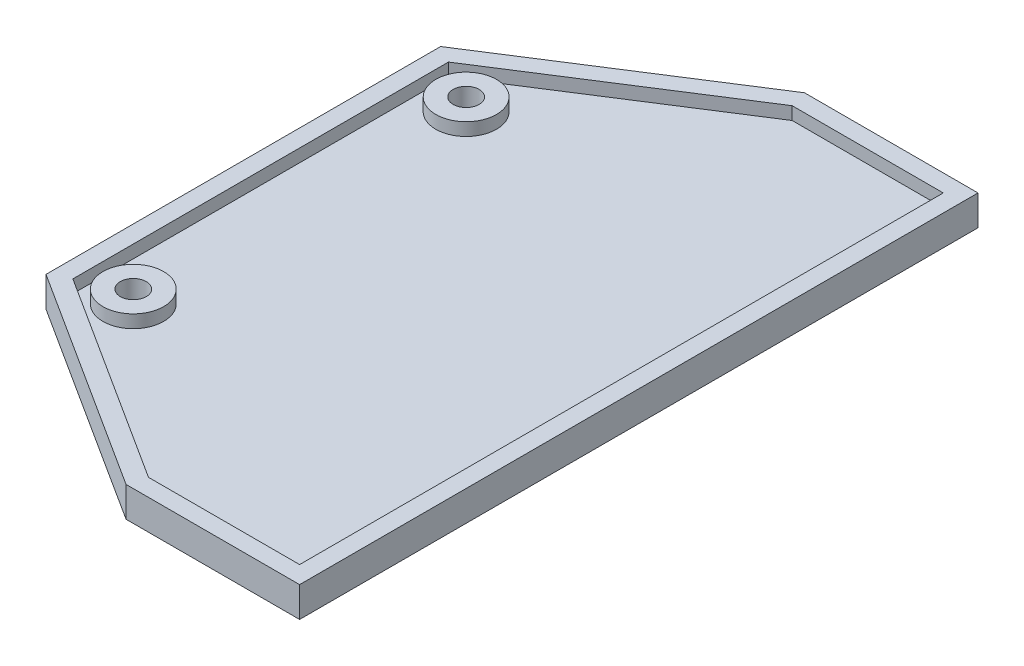
ISO-10303-21;
HEADER;
FILE_DESCRIPTION(('STEP AP214'),'2;1');
FILE_NAME('part.step','',(''),(''),'','','');
FILE_SCHEMA(('AUTOMOTIVE_DESIGN { 1 0 10303 214 1 1 1 1 }'));
ENDSEC;
DATA;
#1=APPLICATION_CONTEXT('core data for automotive mechanical design processes');
#2=APPLICATION_PROTOCOL_DEFINITION('international standard','automotive_design',2000,#1);
#3=PRODUCT_CONTEXT('',#1,'mechanical');
#4=PRODUCT('Part','Part','',(#3));
#5=PRODUCT_RELATED_PRODUCT_CATEGORY('part','',(#4));
#6=PRODUCT_DEFINITION_FORMATION('','',#4);
#7=PRODUCT_DEFINITION_CONTEXT('part definition',#1,'design');
#8=PRODUCT_DEFINITION('design','',#6,#7);
#9=PRODUCT_DEFINITION_SHAPE('','',#8);
#10=(LENGTH_UNIT() NAMED_UNIT(*) SI_UNIT(.MILLI.,.METRE.));
#11=(NAMED_UNIT(*) PLANE_ANGLE_UNIT() SI_UNIT($,.RADIAN.));
#12=(NAMED_UNIT(*) SI_UNIT($,.STERADIAN.) SOLID_ANGLE_UNIT());
#13=UNCERTAINTY_MEASURE_WITH_UNIT(LENGTH_MEASURE(1.E-05),#10,'distance_accuracy_value','');
#14=(GEOMETRIC_REPRESENTATION_CONTEXT(3) GLOBAL_UNCERTAINTY_ASSIGNED_CONTEXT((#13)) GLOBAL_UNIT_ASSIGNED_CONTEXT((#10,
#11,#12)) REPRESENTATION_CONTEXT('',''));
#15=CARTESIAN_POINT('',(0.,0.,0.));
#16=DIRECTION('',(0.,0.,1.));
#17=DIRECTION('',(1.,0.,0.));
#18=AXIS2_PLACEMENT_3D('',#15,#16,#17);
#19=CARTESIAN_POINT('',(-21.9551217627896,3.48000000000004,0.0716000000000189));
#20=DIRECTION('',(0.,-1.,0.));
#21=DIRECTION('',(0.,0.,-1.));
#22=AXIS2_PLACEMENT_3D('',#19,#20,#21);
#23=PLANE('',#22);
#24=CARTESIAN_POINT('',(45.8988782372104,3.48000000000004,19.1788));
#25=DIRECTION('',(0.,-1.,0.));
#26=DIRECTION('',(1.,0.,0.));
#27=AXIS2_PLACEMENT_3D('',#24,#25,#26);
#28=CIRCLE('',#27,1.5);
#29=CARTESIAN_POINT('',(47.3988782372104,3.48000000000004,19.1788));
#30=VERTEX_POINT('',#29);
#31=EDGE_CURVE('E41',#30,#30,#28,.T.);
#32=ORIENTED_EDGE('',*,*,#31,.T.);
#33=EDGE_LOOP('',(#32));
#34=FACE_BOUND('',#33,.T.);
#35=CARTESIAN_POINT('',(45.8988782372104,3.48000000000004,19.1788));
#36=DIRECTION('',(0.,-1.,0.));
#37=DIRECTION('',(1.,0.,0.));
#38=AXIS2_PLACEMENT_3D('',#35,#36,#37);
#39=CIRCLE('',#38,3.5);
#40=CARTESIAN_POINT('',(49.3988782372104,3.48000000000004,19.1788));
#41=VERTEX_POINT('',#40);
#42=EDGE_CURVE('E234',#41,#41,#39,.T.);
#43=ORIENTED_EDGE('',*,*,#42,.F.);
#44=EDGE_LOOP('',(#43));
#45=FACE_BOUND('',#44,.T.);
#46=ADVANCED_FACE('F37',(#34,#45),#23,.F.);
#47=CARTESIAN_POINT('',(45.8988782372104,3.48000000000004,-19.1788));
#48=DIRECTION('',(0.,-1.,0.));
#49=DIRECTION('',(1.,0.,0.));
#50=AXIS2_PLACEMENT_3D('',#47,#48,#49);
#51=CIRCLE('',#50,1.5);
#52=CARTESIAN_POINT('',(47.3988782372104,3.48000000000004,-19.1788));
#53=VERTEX_POINT('',#52);
#54=EDGE_CURVE('E11',#53,#53,#51,.T.);
#55=ORIENTED_EDGE('',*,*,#54,.T.);
#56=EDGE_LOOP('',(#55));
#57=FACE_BOUND('',#56,.T.);
#58=CARTESIAN_POINT('',(45.8988782372104,3.48000000000004,-19.1788));
#59=DIRECTION('',(0.,-1.,0.));
#60=DIRECTION('',(1.,0.,0.));
#61=AXIS2_PLACEMENT_3D('',#58,#59,#60);
#62=CIRCLE('',#61,3.5);
#63=CARTESIAN_POINT('',(49.3988782372104,3.48000000000004,-19.1788));
#64=VERTEX_POINT('',#63);
#65=EDGE_CURVE('E125',#64,#64,#62,.T.);
#66=ORIENTED_EDGE('',*,*,#65,.F.);
#67=EDGE_LOOP('',(#66));
#68=FACE_BOUND('',#67,.T.);
#69=ADVANCED_FACE('F275',(#57,#68),#23,.F.);
#70=CARTESIAN_POINT('',(0.,0.,0.));
#71=DIRECTION('',(0.,1.,0.));
#72=DIRECTION('',(0.,0.,1.));
#73=AXIS2_PLACEMENT_3D('',#70,#71,#72);
#74=PLANE('',#73);
#75=DIRECTION('',(0.,0.,-1.));
#76=VECTOR('',#75,1.);
#77=CARTESIAN_POINT('',(84.9748782372105,0.,39.0892));
#78=LINE('',#77,#76);
#79=CARTESIAN_POINT('',(84.9748782372105,0.,39.0892));
#80=VERTEX_POINT('',#79);
#81=CARTESIAN_POINT('',(84.9748782372105,0.,-39.0892));
#82=VERTEX_POINT('',#81);
#83=EDGE_CURVE('E106',#80,#82,#78,.T.);
#84=ORIENTED_EDGE('',*,*,#83,.F.);
#85=DIRECTION('',(1.,0.,0.));
#86=VECTOR('',#85,1.);
#87=CARTESIAN_POINT('',(84.9748782372105,0.,39.0892));
#88=LINE('',#87,#86);
#89=CARTESIAN_POINT('',(64.9748782372105,0.,39.0892));
#90=VERTEX_POINT('',#89);
#91=EDGE_CURVE('E139',#90,#80,#88,.T.);
#92=ORIENTED_EDGE('',*,*,#91,.F.);
#93=DIRECTION('',(0.842533357884091,0.,0.538644169050922));
#94=VECTOR('',#93,1.);
#95=CARTESIAN_POINT('',(64.9748782372105,0.,39.0892));
#96=LINE('',#95,#94);
#97=CARTESIAN_POINT('',(39.3988782372104,0.,22.7380809152389));
#98=VERTEX_POINT('',#97);
#99=EDGE_CURVE('E136',#98,#90,#96,.T.);
#100=ORIENTED_EDGE('',*,*,#99,.F.);
#101=DIRECTION('',(0.,0.,1.));
#102=VECTOR('',#101,1.);
#103=CARTESIAN_POINT('',(39.3988782372104,0.,-22.7380809152389));
#104=LINE('',#103,#102);
#105=CARTESIAN_POINT('',(39.3988782372104,0.,-22.7380809152389));
#106=VERTEX_POINT('',#105);
#107=EDGE_CURVE('E132',#106,#98,#104,.T.);
#108=ORIENTED_EDGE('',*,*,#107,.F.);
#109=DIRECTION('',(-0.842533357884091,0.,0.538644169050922));
#110=VECTOR('',#109,1.);
#111=CARTESIAN_POINT('',(64.9748782372105,0.,-39.0892));
#112=LINE('',#111,#110);
#113=CARTESIAN_POINT('',(64.9748782372105,0.,-39.0892));
#114=VERTEX_POINT('',#113);
#115=EDGE_CURVE('E109',#114,#106,#112,.T.);
#116=ORIENTED_EDGE('',*,*,#115,.F.);
#117=DIRECTION('',(-1.,0.,0.));
#118=VECTOR('',#117,1.);
#119=CARTESIAN_POINT('',(84.9748782372105,0.,-39.0892));
#120=LINE('',#119,#118);
#121=EDGE_CURVE('E95',#82,#114,#120,.T.);
#122=ORIENTED_EDGE('',*,*,#121,.F.);
#123=EDGE_LOOP('',(#84,#92,#100,#108,#116,#122));
#124=FACE_BOUND('',#123,.T.);
#125=CARTESIAN_POINT('',(45.8988782372104,0.,-19.1788));
#126=DIRECTION('',(0.,1.,0.));
#127=DIRECTION('',(0.,0.,1.));
#128=AXIS2_PLACEMENT_3D('',#125,#126,#127);
#129=CIRCLE('',#128,1.5);
#130=CARTESIAN_POINT('',(45.8988782372104,0.,-17.6788));
#131=VERTEX_POINT('',#130);
#132=EDGE_CURVE('E121',#131,#131,#129,.T.);
#133=ORIENTED_EDGE('',*,*,#132,.T.);
#134=EDGE_LOOP('',(#133));
#135=FACE_BOUND('',#134,.T.);
#136=CARTESIAN_POINT('',(45.8988782372104,0.,19.1788));
#137=DIRECTION('',(0.,1.,0.));
#138=DIRECTION('',(0.,0.,-1.));
#139=AXIS2_PLACEMENT_3D('',#136,#137,#138);
#140=CIRCLE('',#139,1.5);
#141=CARTESIAN_POINT('',(45.8988782372104,0.,17.6788));
#142=VERTEX_POINT('',#141);
#143=EDGE_CURVE('E124',#142,#142,#140,.T.);
#144=ORIENTED_EDGE('',*,*,#143,.T.);
#145=EDGE_LOOP('',(#144));
#146=FACE_BOUND('',#145,.T.);
#147=ADVANCED_FACE('F103',(#124,#135,#146),#74,.F.);
#148=CARTESIAN_POINT('',(84.9748782372105,93.9732815327194,39.0892));
#149=DIRECTION('',(-1.,0.,0.));
#150=DIRECTION('',(0.,0.,1.));
#151=AXIS2_PLACEMENT_3D('',#148,#149,#150);
#152=PLANE('',#151);
#153=DIRECTION('',(0.,-1.,0.));
#154=VECTOR('',#153,1.);
#155=CARTESIAN_POINT('',(84.9748782372105,93.9732815327194,-39.0892));
#156=LINE('',#155,#154);
#157=CARTESIAN_POINT('',(84.9748782372105,3.48000000000004,-39.0892));
#158=VERTEX_POINT('',#157);
#159=EDGE_CURVE('E91',#158,#82,#156,.T.);
#160=ORIENTED_EDGE('',*,*,#159,.F.);
#161=DIRECTION('',(0.,0.,1.));
#162=VECTOR('',#161,1.);
#163=CARTESIAN_POINT('',(84.9748782372105,3.48000000000004,39.0892));
#164=LINE('',#163,#162);
#165=CARTESIAN_POINT('',(84.9748782372105,3.48000000000004,39.0892));
#166=VERTEX_POINT('',#165);
#167=EDGE_CURVE('E61',#158,#166,#164,.T.);
#168=ORIENTED_EDGE('',*,*,#167,.T.);
#169=DIRECTION('',(0.,-1.,0.));
#170=VECTOR('',#169,1.);
#171=CARTESIAN_POINT('',(84.9748782372105,93.9732815327194,39.0892));
#172=LINE('',#171,#170);
#173=EDGE_CURVE('E114',#166,#80,#172,.T.);
#174=ORIENTED_EDGE('',*,*,#173,.T.);
#175=ORIENTED_EDGE('',*,*,#83,.T.);
#176=EDGE_LOOP('',(#160,#168,#174,#175));
#177=FACE_BOUND('',#176,.T.);
#178=ADVANCED_FACE('F112',(#177),#152,.F.);
#179=CARTESIAN_POINT('',(84.9748782372105,93.9732815327194,-39.0892));
#180=DIRECTION('',(0.,0.,1.));
#181=DIRECTION('',(1.,0.,0.));
#182=AXIS2_PLACEMENT_3D('',#179,#180,#181);
#183=PLANE('',#182);
#184=DIRECTION('',(0.,-1.,0.));
#185=VECTOR('',#184,1.);
#186=CARTESIAN_POINT('',(64.9748782372105,93.9732815327194,-39.0892));
#187=LINE('',#186,#185);
#188=CARTESIAN_POINT('',(64.9748782372105,3.48000000000004,-39.0892));
#189=VERTEX_POINT('',#188);
#190=EDGE_CURVE('E128',#189,#114,#187,.T.);
#191=ORIENTED_EDGE('',*,*,#190,.F.);
#192=DIRECTION('',(1.,0.,0.));
#193=VECTOR('',#192,1.);
#194=CARTESIAN_POINT('',(84.9748782372105,3.48000000000004,-39.0892));
#195=LINE('',#194,#193);
#196=EDGE_CURVE('E97',#189,#158,#195,.T.);
#197=ORIENTED_EDGE('',*,*,#196,.T.);
#198=ORIENTED_EDGE('',*,*,#159,.T.);
#199=ORIENTED_EDGE('',*,*,#121,.T.);
#200=EDGE_LOOP('',(#191,#197,#198,#199));
#201=FACE_BOUND('',#200,.T.);
#202=ADVANCED_FACE('F94',(#201),#183,.F.);
#203=CARTESIAN_POINT('',(64.9748782372105,93.9732815327194,-39.0892));
#204=DIRECTION('',(0.538644169050922,0.,0.842533357884091));
#205=DIRECTION('',(0.842533357884091,0.,-0.538644169050922));
#206=AXIS2_PLACEMENT_3D('',#203,#204,#205);
#207=PLANE('',#206);
#208=DIRECTION('',(0.,-1.,0.));
#209=VECTOR('',#208,1.);
#210=CARTESIAN_POINT('',(39.3988782372104,93.9732815327194,-22.7380809152389));
#211=LINE('',#210,#209);
#212=CARTESIAN_POINT('',(39.3988782372104,3.48000000000004,-22.7380809152389));
#213=VERTEX_POINT('',#212);
#214=EDGE_CURVE('E130',#213,#106,#211,.T.);
#215=ORIENTED_EDGE('',*,*,#214,.F.);
#216=DIRECTION('',(0.842533357884091,0.,-0.538644169050922));
#217=VECTOR('',#216,1.);
#218=CARTESIAN_POINT('',(64.9748782372105,3.48000000000004,-39.0892));
#219=LINE('',#218,#217);
#220=EDGE_CURVE('E110',#213,#189,#219,.T.);
#221=ORIENTED_EDGE('',*,*,#220,.T.);
#222=ORIENTED_EDGE('',*,*,#190,.T.);
#223=ORIENTED_EDGE('',*,*,#115,.T.);
#224=EDGE_LOOP('',(#215,#221,#222,#223));
#225=FACE_BOUND('',#224,.T.);
#226=ADVANCED_FACE('F162',(#225),#207,.F.);
#227=CARTESIAN_POINT('',(39.3988782372104,93.9732815327194,-22.7380809152389));
#228=DIRECTION('',(1.,0.,0.));
#229=DIRECTION('',(0.,0.,-1.));
#230=AXIS2_PLACEMENT_3D('',#227,#228,#229);
#231=PLANE('',#230);
#232=DIRECTION('',(0.,-1.,0.));
#233=VECTOR('',#232,1.);
#234=CARTESIAN_POINT('',(39.3988782372104,93.9732815327194,22.7380809152389));
#235=LINE('',#234,#233);
#236=CARTESIAN_POINT('',(39.3988782372104,3.48000000000004,22.7380809152389));
#237=VERTEX_POINT('',#236);
#238=EDGE_CURVE('E134',#237,#98,#235,.T.);
#239=ORIENTED_EDGE('',*,*,#238,.F.);
#240=DIRECTION('',(0.,0.,-1.));
#241=VECTOR('',#240,1.);
#242=CARTESIAN_POINT('',(39.3988782372104,3.48000000000004,-22.7380809152389));
#243=LINE('',#242,#241);
#244=EDGE_CURVE('E133',#237,#213,#243,.T.);
#245=ORIENTED_EDGE('',*,*,#244,.T.);
#246=ORIENTED_EDGE('',*,*,#214,.T.);
#247=ORIENTED_EDGE('',*,*,#107,.T.);
#248=EDGE_LOOP('',(#239,#245,#246,#247));
#249=FACE_BOUND('',#248,.T.);
#250=ADVANCED_FACE('F166',(#249),#231,.F.);
#251=CARTESIAN_POINT('',(64.9748782372105,93.9732815327194,39.0892));
#252=DIRECTION('',(0.538644169050922,0.,-0.842533357884091));
#253=DIRECTION('',(-0.842533357884091,0.,-0.538644169050922));
#254=AXIS2_PLACEMENT_3D('',#251,#252,#253);
#255=PLANE('',#254);
#256=DIRECTION('',(0.,-1.,0.));
#257=VECTOR('',#256,1.);
#258=CARTESIAN_POINT('',(64.9748782372105,93.9732815327194,39.0892));
#259=LINE('',#258,#257);
#260=CARTESIAN_POINT('',(64.9748782372105,3.48000000000004,39.0892));
#261=VERTEX_POINT('',#260);
#262=EDGE_CURVE('E138',#261,#90,#259,.T.);
#263=ORIENTED_EDGE('',*,*,#262,.F.);
#264=DIRECTION('',(-0.842533357884091,0.,-0.538644169050922));
#265=VECTOR('',#264,1.);
#266=CARTESIAN_POINT('',(64.9748782372105,3.48000000000004,39.0892));
#267=LINE('',#266,#265);
#268=EDGE_CURVE('E137',#261,#237,#267,.T.);
#269=ORIENTED_EDGE('',*,*,#268,.T.);
#270=ORIENTED_EDGE('',*,*,#238,.T.);
#271=ORIENTED_EDGE('',*,*,#99,.T.);
#272=EDGE_LOOP('',(#263,#269,#270,#271));
#273=FACE_BOUND('',#272,.T.);
#274=ADVANCED_FACE('F324',(#273),#255,.F.);
#275=CARTESIAN_POINT('',(84.9748782372105,93.9732815327194,39.0892));
#276=DIRECTION('',(0.,0.,-1.));
#277=DIRECTION('',(-1.,0.,0.));
#278=AXIS2_PLACEMENT_3D('',#275,#276,#277);
#279=PLANE('',#278);
#280=ORIENTED_EDGE('',*,*,#173,.F.);
#281=DIRECTION('',(-1.,0.,0.));
#282=VECTOR('',#281,1.);
#283=CARTESIAN_POINT('',(84.9748782372105,3.48000000000004,39.0892));
#284=LINE('',#283,#282);
#285=EDGE_CURVE('E140',#166,#261,#284,.T.);
#286=ORIENTED_EDGE('',*,*,#285,.T.);
#287=ORIENTED_EDGE('',*,*,#262,.T.);
#288=ORIENTED_EDGE('',*,*,#91,.T.);
#289=EDGE_LOOP('',(#280,#286,#287,#288));
#290=FACE_BOUND('',#289,.T.);
#291=ADVANCED_FACE('F321',(#290),#279,.F.);
#292=CARTESIAN_POINT('',(45.8988782372104,93.9732815327194,-19.1788));
#293=DIRECTION('',(0.,-1.,0.));
#294=DIRECTION('',(0.,0.,-1.));
#295=AXIS2_PLACEMENT_3D('',#292,#293,#294);
#296=CYLINDRICAL_SURFACE('',#295,1.5);
#297=ORIENTED_EDGE('',*,*,#54,.F.);
#298=EDGE_LOOP('',(#297));
#299=FACE_BOUND('',#298,.T.);
#300=ORIENTED_EDGE('',*,*,#132,.F.);
#301=EDGE_LOOP('',(#300));
#302=FACE_BOUND('',#301,.T.);
#303=ADVANCED_FACE('F290',(#299,#302),#296,.F.);
#304=CARTESIAN_POINT('',(45.8988782372104,93.9732815327194,19.1788));
#305=DIRECTION('',(0.,-1.,0.));
#306=DIRECTION('',(0.,0.,-1.));
#307=AXIS2_PLACEMENT_3D('',#304,#305,#306);
#308=CYLINDRICAL_SURFACE('',#307,1.5);
#309=ORIENTED_EDGE('',*,*,#31,.F.);
#310=EDGE_LOOP('',(#309));
#311=FACE_BOUND('',#310,.T.);
#312=ORIENTED_EDGE('',*,*,#143,.F.);
#313=EDGE_LOOP('',(#312));
#314=FACE_BOUND('',#313,.T.);
#315=ADVANCED_FACE('F283',(#311,#314),#308,.F.);
#316=DIRECTION('',(0.842533357884091,0.,-0.538644169050922));
#317=VECTOR('',#316,1.);
#318=CARTESIAN_POINT('',(66.0521665753124,3.48000000000004,-37.4041332842318));
#319=LINE('',#318,#317);
#320=CARTESIAN_POINT('',(41.3988782372104,3.48000000000004,-21.6429175567038));
#321=VERTEX_POINT('',#320);
#322=CARTESIAN_POINT('',(65.559556030691,3.48000000000004,-37.0892));
#323=VERTEX_POINT('',#322);
#324=EDGE_CURVE('E221',#321,#323,#319,.T.);
#325=ORIENTED_EDGE('',*,*,#324,.T.);
#326=DIRECTION('',(1.,0.,0.));
#327=VECTOR('',#326,1.);
#328=CARTESIAN_POINT('',(84.9748782372105,3.48000000000004,-37.0892));
#329=LINE('',#328,#327);
#330=CARTESIAN_POINT('',(82.9748782372105,3.48000000000004,-37.0892));
#331=VERTEX_POINT('',#330);
#332=EDGE_CURVE('E212',#323,#331,#329,.T.);
#333=ORIENTED_EDGE('',*,*,#332,.T.);
#334=DIRECTION('',(0.,0.,1.));
#335=VECTOR('',#334,1.);
#336=CARTESIAN_POINT('',(82.9748782372105,3.48000000000004,39.0892));
#337=LINE('',#336,#335);
#338=CARTESIAN_POINT('',(82.9748782372105,3.48000000000004,37.0892));
#339=VERTEX_POINT('',#338);
#340=EDGE_CURVE('E208',#331,#339,#337,.T.);
#341=ORIENTED_EDGE('',*,*,#340,.T.);
#342=DIRECTION('',(-1.,0.,0.));
#343=VECTOR('',#342,1.);
#344=CARTESIAN_POINT('',(84.9748782372105,3.48000000000004,37.0892));
#345=LINE('',#344,#343);
#346=CARTESIAN_POINT('',(65.559556030691,3.48000000000004,37.0892));
#347=VERTEX_POINT('',#346);
#348=EDGE_CURVE('E238',#339,#347,#345,.T.);
#349=ORIENTED_EDGE('',*,*,#348,.T.);
#350=DIRECTION('',(-0.842533357884091,0.,-0.538644169050922));
#351=VECTOR('',#350,1.);
#352=CARTESIAN_POINT('',(66.0521665753124,3.48000000000004,37.4041332842318));
#353=LINE('',#352,#351);
#354=CARTESIAN_POINT('',(41.3988782372104,3.48000000000004,21.6429175567038));
#355=VERTEX_POINT('',#354);
#356=EDGE_CURVE('E243',#347,#355,#353,.T.);
#357=ORIENTED_EDGE('',*,*,#356,.T.);
#358=DIRECTION('',(0.,0.,-1.));
#359=VECTOR('',#358,1.);
#360=CARTESIAN_POINT('',(41.3988782372104,3.48000000000004,-22.7380809152389));
#361=LINE('',#360,#359);
#362=EDGE_CURVE('E246',#355,#321,#361,.T.);
#363=ORIENTED_EDGE('',*,*,#362,.T.);
#364=EDGE_LOOP('',(#325,#333,#341,#349,#357,#363));
#365=FACE_BOUND('',#364,.T.);
#366=ORIENTED_EDGE('',*,*,#196,.F.);
#367=ORIENTED_EDGE('',*,*,#220,.F.);
#368=ORIENTED_EDGE('',*,*,#244,.F.);
#369=ORIENTED_EDGE('',*,*,#268,.F.);
#370=ORIENTED_EDGE('',*,*,#285,.F.);
#371=ORIENTED_EDGE('',*,*,#167,.F.);
#372=EDGE_LOOP('',(#366,#367,#368,#369,#370,#371));
#373=FACE_BOUND('',#372,.T.);
#374=ADVANCED_FACE('F39',(#365,#373),#23,.F.);
#375=CARTESIAN_POINT('',(0.,2.,0.));
#376=DIRECTION('',(0.,1.,0.));
#377=DIRECTION('',(0.,0.,1.));
#378=AXIS2_PLACEMENT_3D('',#375,#376,#377);
#379=PLANE('',#378);
#380=DIRECTION('',(0.,0.,-1.));
#381=VECTOR('',#380,1.);
#382=CARTESIAN_POINT('',(82.9748782372105,2.,39.0892));
#383=LINE('',#382,#381);
#384=CARTESIAN_POINT('',(82.9748782372105,2.,37.0892));
#385=VERTEX_POINT('',#384);
#386=CARTESIAN_POINT('',(82.9748782372105,2.,-37.0892));
#387=VERTEX_POINT('',#386);
#388=EDGE_CURVE('E206',#385,#387,#383,.T.);
#389=ORIENTED_EDGE('',*,*,#388,.T.);
#390=DIRECTION('',(-1.,0.,0.));
#391=VECTOR('',#390,1.);
#392=CARTESIAN_POINT('',(84.9748782372105,2.,-37.0892));
#393=LINE('',#392,#391);
#394=CARTESIAN_POINT('',(65.559556030691,2.,-37.0892));
#395=VERTEX_POINT('',#394);
#396=EDGE_CURVE('E211',#387,#395,#393,.T.);
#397=ORIENTED_EDGE('',*,*,#396,.T.);
#398=DIRECTION('',(-0.842533357884091,0.,0.538644169050922));
#399=VECTOR('',#398,1.);
#400=CARTESIAN_POINT('',(66.0521665753124,2.,-37.4041332842318));
#401=LINE('',#400,#399);
#402=CARTESIAN_POINT('',(41.3988782372104,2.,-21.6429175567038));
#403=VERTEX_POINT('',#402);
#404=EDGE_CURVE('E245',#395,#403,#401,.T.);
#405=ORIENTED_EDGE('',*,*,#404,.T.);
#406=DIRECTION('',(0.,0.,1.));
#407=VECTOR('',#406,1.);
#408=CARTESIAN_POINT('',(41.3988782372104,2.,-22.7380809152389));
#409=LINE('',#408,#407);
#410=CARTESIAN_POINT('',(41.3988782372104,2.,21.6429175567038));
#411=VERTEX_POINT('',#410);
#412=EDGE_CURVE('E240',#403,#411,#409,.T.);
#413=ORIENTED_EDGE('',*,*,#412,.T.);
#414=DIRECTION('',(0.842533357884091,0.,0.538644169050922));
#415=VECTOR('',#414,1.);
#416=CARTESIAN_POINT('',(66.0521665753124,2.,37.4041332842318));
#417=LINE('',#416,#415);
#418=CARTESIAN_POINT('',(65.559556030691,2.,37.0892));
#419=VERTEX_POINT('',#418);
#420=EDGE_CURVE('E236',#411,#419,#417,.T.);
#421=ORIENTED_EDGE('',*,*,#420,.T.);
#422=DIRECTION('',(1.,0.,0.));
#423=VECTOR('',#422,1.);
#424=CARTESIAN_POINT('',(84.9748782372105,2.,37.0892));
#425=LINE('',#424,#423);
#426=EDGE_CURVE('E228',#419,#385,#425,.T.);
#427=ORIENTED_EDGE('',*,*,#426,.T.);
#428=EDGE_LOOP('',(#389,#397,#405,#413,#421,#427));
#429=FACE_BOUND('',#428,.T.);
#430=CARTESIAN_POINT('',(45.8988782372104,2.,-19.1788));
#431=DIRECTION('',(0.,1.,0.));
#432=DIRECTION('',(0.,0.,1.));
#433=AXIS2_PLACEMENT_3D('',#430,#431,#432);
#434=CIRCLE('',#433,3.5);
#435=CARTESIAN_POINT('',(45.8988782372104,2.,-15.6788));
#436=VERTEX_POINT('',#435);
#437=EDGE_CURVE('E248',#436,#436,#434,.T.);
#438=ORIENTED_EDGE('',*,*,#437,.F.);
#439=EDGE_LOOP('',(#438));
#440=FACE_BOUND('',#439,.T.);
#441=CARTESIAN_POINT('',(45.8988782372104,2.,19.1788));
#442=DIRECTION('',(0.,1.,0.));
#443=DIRECTION('',(0.,0.,1.));
#444=AXIS2_PLACEMENT_3D('',#441,#442,#443);
#445=CIRCLE('',#444,3.5);
#446=CARTESIAN_POINT('',(45.8988782372104,2.,22.6788));
#447=VERTEX_POINT('',#446);
#448=EDGE_CURVE('E251',#447,#447,#445,.T.);
#449=ORIENTED_EDGE('',*,*,#448,.F.);
#450=EDGE_LOOP('',(#449));
#451=FACE_BOUND('',#450,.T.);
#452=ADVANCED_FACE('F224',(#429,#440,#451),#379,.T.);
#453=CARTESIAN_POINT('',(82.9748782372105,93.9732815327194,39.0892));
#454=DIRECTION('',(-1.,0.,0.));
#455=DIRECTION('',(0.,0.,1.));
#456=AXIS2_PLACEMENT_3D('',#453,#454,#455);
#457=PLANE('',#456);
#458=DIRECTION('',(0.,-1.,0.));
#459=VECTOR('',#458,1.);
#460=CARTESIAN_POINT('',(82.9748782372105,93.9732815327194,-37.0892));
#461=LINE('',#460,#459);
#462=EDGE_CURVE('E202',#331,#387,#461,.T.);
#463=ORIENTED_EDGE('',*,*,#462,.T.);
#464=ORIENTED_EDGE('',*,*,#388,.F.);
#465=DIRECTION('',(0.,-1.,0.));
#466=VECTOR('',#465,1.);
#467=CARTESIAN_POINT('',(82.9748782372105,93.9732815327194,37.0892));
#468=LINE('',#467,#466);
#469=EDGE_CURVE('E52',#339,#385,#468,.T.);
#470=ORIENTED_EDGE('',*,*,#469,.F.);
#471=ORIENTED_EDGE('',*,*,#340,.F.);
#472=EDGE_LOOP('',(#463,#464,#470,#471));
#473=FACE_BOUND('',#472,.T.);
#474=ADVANCED_FACE('F204',(#473),#457,.T.);
#475=CARTESIAN_POINT('',(84.9748782372105,93.9732815327194,-37.0892));
#476=DIRECTION('',(0.,0.,1.));
#477=DIRECTION('',(1.,0.,0.));
#478=AXIS2_PLACEMENT_3D('',#475,#476,#477);
#479=PLANE('',#478);
#480=DIRECTION('',(0.,-1.,0.));
#481=VECTOR('',#480,1.);
#482=CARTESIAN_POINT('',(65.559556030691,93.9732815327194,-37.0892));
#483=LINE('',#482,#481);
#484=EDGE_CURVE('E217',#323,#395,#483,.T.);
#485=ORIENTED_EDGE('',*,*,#484,.T.);
#486=ORIENTED_EDGE('',*,*,#396,.F.);
#487=ORIENTED_EDGE('',*,*,#462,.F.);
#488=ORIENTED_EDGE('',*,*,#332,.F.);
#489=EDGE_LOOP('',(#485,#486,#487,#488));
#490=FACE_BOUND('',#489,.T.);
#491=ADVANCED_FACE('F215',(#490),#479,.T.);
#492=CARTESIAN_POINT('',(66.0521665753124,93.9732815327194,-37.4041332842318));
#493=DIRECTION('',(0.538644169050922,0.,0.842533357884091));
#494=DIRECTION('',(0.842533357884091,0.,-0.538644169050922));
#495=AXIS2_PLACEMENT_3D('',#492,#493,#494);
#496=PLANE('',#495);
#497=DIRECTION('',(0.,-1.,0.));
#498=VECTOR('',#497,1.);
#499=CARTESIAN_POINT('',(41.3988782372104,93.9732815327194,-21.6429175567038));
#500=LINE('',#499,#498);
#501=EDGE_CURVE('E244',#321,#403,#500,.T.);
#502=ORIENTED_EDGE('',*,*,#501,.T.);
#503=ORIENTED_EDGE('',*,*,#404,.F.);
#504=ORIENTED_EDGE('',*,*,#484,.F.);
#505=ORIENTED_EDGE('',*,*,#324,.F.);
#506=EDGE_LOOP('',(#502,#503,#504,#505));
#507=FACE_BOUND('',#506,.T.);
#508=ADVANCED_FACE('F294',(#507),#496,.T.);
#509=CARTESIAN_POINT('',(41.3988782372104,93.9732815327194,-22.7380809152389));
#510=DIRECTION('',(1.,0.,0.));
#511=DIRECTION('',(0.,0.,-1.));
#512=AXIS2_PLACEMENT_3D('',#509,#510,#511);
#513=PLANE('',#512);
#514=DIRECTION('',(0.,-1.,0.));
#515=VECTOR('',#514,1.);
#516=CARTESIAN_POINT('',(41.3988782372104,93.9732815327194,21.6429175567038));
#517=LINE('',#516,#515);
#518=EDGE_CURVE('E239',#355,#411,#517,.T.);
#519=ORIENTED_EDGE('',*,*,#518,.T.);
#520=ORIENTED_EDGE('',*,*,#412,.F.);
#521=ORIENTED_EDGE('',*,*,#501,.F.);
#522=ORIENTED_EDGE('',*,*,#362,.F.);
#523=EDGE_LOOP('',(#519,#520,#521,#522));
#524=FACE_BOUND('',#523,.T.);
#525=ADVANCED_FACE('F297',(#524),#513,.T.);
#526=CARTESIAN_POINT('',(66.0521665753124,93.9732815327194,37.4041332842318));
#527=DIRECTION('',(0.538644169050922,0.,-0.842533357884091));
#528=DIRECTION('',(-0.842533357884091,0.,-0.538644169050922));
#529=AXIS2_PLACEMENT_3D('',#526,#527,#528);
#530=PLANE('',#529);
#531=DIRECTION('',(0.,-1.,0.));
#532=VECTOR('',#531,1.);
#533=CARTESIAN_POINT('',(65.559556030691,93.9732815327194,37.0892));
#534=LINE('',#533,#532);
#535=EDGE_CURVE('E235',#347,#419,#534,.T.);
#536=ORIENTED_EDGE('',*,*,#535,.T.);
#537=ORIENTED_EDGE('',*,*,#420,.F.);
#538=ORIENTED_EDGE('',*,*,#518,.F.);
#539=ORIENTED_EDGE('',*,*,#356,.F.);
#540=EDGE_LOOP('',(#536,#537,#538,#539));
#541=FACE_BOUND('',#540,.T.);
#542=ADVANCED_FACE('F301',(#541),#530,.T.);
#543=CARTESIAN_POINT('',(84.9748782372105,93.9732815327194,37.0892));
#544=DIRECTION('',(0.,0.,-1.));
#545=DIRECTION('',(-1.,0.,0.));
#546=AXIS2_PLACEMENT_3D('',#543,#544,#545);
#547=PLANE('',#546);
#548=ORIENTED_EDGE('',*,*,#469,.T.);
#549=ORIENTED_EDGE('',*,*,#426,.F.);
#550=ORIENTED_EDGE('',*,*,#535,.F.);
#551=ORIENTED_EDGE('',*,*,#348,.F.);
#552=EDGE_LOOP('',(#548,#549,#550,#551));
#553=FACE_BOUND('',#552,.T.);
#554=ADVANCED_FACE('F304',(#553),#547,.T.);
#555=CARTESIAN_POINT('',(45.8988782372104,93.9732815327194,-19.1788));
#556=DIRECTION('',(0.,-1.,0.));
#557=DIRECTION('',(0.,0.,-1.));
#558=AXIS2_PLACEMENT_3D('',#555,#556,#557);
#559=CYLINDRICAL_SURFACE('',#558,3.5);
#560=ORIENTED_EDGE('',*,*,#65,.T.);
#561=EDGE_LOOP('',(#560));
#562=FACE_BOUND('',#561,.T.);
#563=ORIENTED_EDGE('',*,*,#437,.T.);
#564=EDGE_LOOP('',(#563));
#565=FACE_BOUND('',#564,.T.);
#566=ADVANCED_FACE('F306',(#562,#565),#559,.T.);
#567=CARTESIAN_POINT('',(45.8988782372104,93.9732815327194,19.1788));
#568=DIRECTION('',(0.,-1.,0.));
#569=DIRECTION('',(0.,0.,-1.));
#570=AXIS2_PLACEMENT_3D('',#567,#568,#569);
#571=CYLINDRICAL_SURFACE('',#570,3.5);
#572=ORIENTED_EDGE('',*,*,#42,.T.);
#573=EDGE_LOOP('',(#572));
#574=FACE_BOUND('',#573,.T.);
#575=ORIENTED_EDGE('',*,*,#448,.T.);
#576=EDGE_LOOP('',(#575));
#577=FACE_BOUND('',#576,.T.);
#578=ADVANCED_FACE('F271',(#574,#577),#571,.T.);
#579=CLOSED_SHELL('',(#46,#69,#147,#178,#202,#226,#250,#274,#291,#303,#315,#374,#452,#474,#491,
#508,#525,#542,#554,#566,#578));
#580=MANIFOLD_SOLID_BREP('B2',#579);
#581=ADVANCED_BREP_SHAPE_REPRESENTATION('',(#18,#580),#14);
#582=SHAPE_DEFINITION_REPRESENTATION(#9,#581);
ENDSEC;
END-ISO-10303-21;
